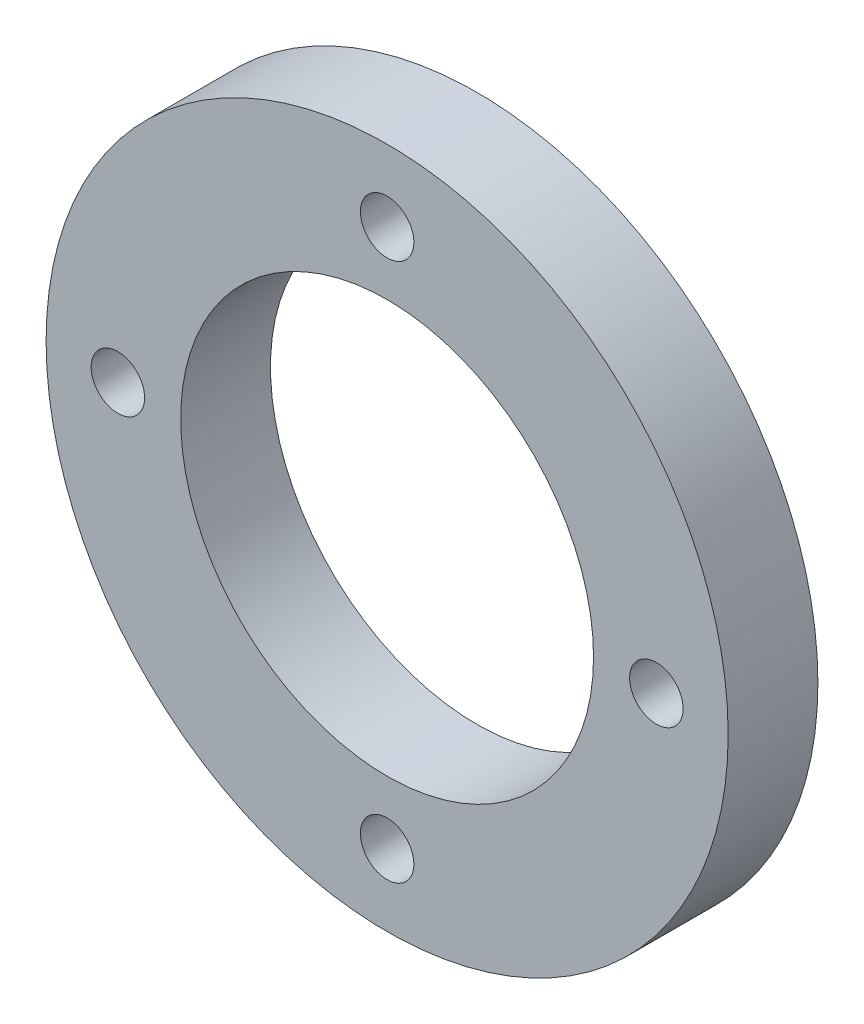
ISO-10303-21;
HEADER;
FILE_DESCRIPTION(('STEP AP214'),'2;1');
FILE_NAME('part.step','',(''),(''),'','','');
FILE_SCHEMA(('AUTOMOTIVE_DESIGN { 1 0 10303 214 1 1 1 1 }'));
ENDSEC;
DATA;
#1=APPLICATION_CONTEXT('core data for automotive mechanical design processes');
#2=APPLICATION_PROTOCOL_DEFINITION('international standard','automotive_design',2000,#1);
#3=PRODUCT_CONTEXT('',#1,'mechanical');
#4=PRODUCT('Part','Part','',(#3));
#5=PRODUCT_RELATED_PRODUCT_CATEGORY('part','',(#4));
#6=PRODUCT_DEFINITION_FORMATION('','',#4);
#7=PRODUCT_DEFINITION_CONTEXT('part definition',#1,'design');
#8=PRODUCT_DEFINITION('design','',#6,#7);
#9=PRODUCT_DEFINITION_SHAPE('','',#8);
#10=(LENGTH_UNIT() NAMED_UNIT(*) SI_UNIT(.MILLI.,.METRE.));
#11=(NAMED_UNIT(*) PLANE_ANGLE_UNIT() SI_UNIT($,.RADIAN.));
#12=(NAMED_UNIT(*) SI_UNIT($,.STERADIAN.) SOLID_ANGLE_UNIT());
#13=UNCERTAINTY_MEASURE_WITH_UNIT(LENGTH_MEASURE(1.E-05),#10,'distance_accuracy_value','');
#14=(GEOMETRIC_REPRESENTATION_CONTEXT(3) GLOBAL_UNCERTAINTY_ASSIGNED_CONTEXT((#13)) GLOBAL_UNIT_ASSIGNED_CONTEXT((#10,
#11,#12)) REPRESENTATION_CONTEXT('',''));
#15=CARTESIAN_POINT('',(0.,0.,0.));
#16=DIRECTION('',(0.,0.,1.));
#17=DIRECTION('',(1.,0.,0.));
#18=AXIS2_PLACEMENT_3D('',#15,#16,#17);
#19=CARTESIAN_POINT('',(0.,0.,5.));
#20=DIRECTION('',(0.,0.,-1.));
#21=DIRECTION('',(-1.,0.,0.));
#22=AXIS2_PLACEMENT_3D('',#19,#20,#21);
#23=CYLINDRICAL_SURFACE('',#22,11.5);
#24=CARTESIAN_POINT('',(0.,0.,5.));
#25=DIRECTION('',(0.,0.,1.));
#26=DIRECTION('',(1.,0.,0.));
#27=AXIS2_PLACEMENT_3D('',#24,#25,#26);
#28=CIRCLE('',#27,11.5);
#29=CARTESIAN_POINT('',(11.5,0.,5.));
#30=VERTEX_POINT('',#29);
#31=EDGE_CURVE('E54',#30,#30,#28,.T.);
#32=ORIENTED_EDGE('',*,*,#31,.T.);
#33=EDGE_LOOP('',(#32));
#34=FACE_BOUND('',#33,.T.);
#35=CARTESIAN_POINT('',(0.,0.,0.));
#36=DIRECTION('',(0.,0.,1.));
#37=DIRECTION('',(1.,0.,0.));
#38=AXIS2_PLACEMENT_3D('',#35,#36,#37);
#39=CIRCLE('',#38,11.5);
#40=CARTESIAN_POINT('',(11.5,0.,0.));
#41=VERTEX_POINT('',#40);
#42=EDGE_CURVE('E79',#41,#41,#39,.T.);
#43=ORIENTED_EDGE('',*,*,#42,.F.);
#44=EDGE_LOOP('',(#43));
#45=FACE_BOUND('',#44,.T.);
#46=ADVANCED_FACE('F45',(#34,#45),#23,.F.);
#47=CARTESIAN_POINT('',(0.,15.,5.));
#48=DIRECTION('',(0.,0.,-1.));
#49=DIRECTION('',(-1.,0.,0.));
#50=AXIS2_PLACEMENT_3D('',#47,#48,#49);
#51=CYLINDRICAL_SURFACE('',#50,1.49);
#52=CARTESIAN_POINT('',(0.,15.,5.));
#53=DIRECTION('',(0.,0.,1.));
#54=DIRECTION('',(1.,0.,0.));
#55=AXIS2_PLACEMENT_3D('',#52,#53,#54);
#56=CIRCLE('',#55,1.49);
#57=CARTESIAN_POINT('',(1.49,15.,5.));
#58=VERTEX_POINT('',#57);
#59=EDGE_CURVE('E60',#58,#58,#56,.T.);
#60=ORIENTED_EDGE('',*,*,#59,.T.);
#61=EDGE_LOOP('',(#60));
#62=FACE_BOUND('',#61,.T.);
#63=CARTESIAN_POINT('',(0.,15.,0.));
#64=DIRECTION('',(0.,0.,1.));
#65=DIRECTION('',(1.,0.,0.));
#66=AXIS2_PLACEMENT_3D('',#63,#64,#65);
#67=CIRCLE('',#66,1.49);
#68=CARTESIAN_POINT('',(1.49,15.,0.));
#69=VERTEX_POINT('',#68);
#70=EDGE_CURVE('E76',#69,#69,#67,.T.);
#71=ORIENTED_EDGE('',*,*,#70,.F.);
#72=EDGE_LOOP('',(#71));
#73=FACE_BOUND('',#72,.T.);
#74=ADVANCED_FACE('F106',(#62,#73),#51,.F.);
#75=CARTESIAN_POINT('',(15.,0.,5.));
#76=DIRECTION('',(0.,0.,-1.));
#77=DIRECTION('',(-1.,0.,0.));
#78=AXIS2_PLACEMENT_3D('',#75,#76,#77);
#79=CYLINDRICAL_SURFACE('',#78,1.49);
#80=CARTESIAN_POINT('',(15.,0.,5.));
#81=DIRECTION('',(0.,0.,1.));
#82=DIRECTION('',(1.,0.,0.));
#83=AXIS2_PLACEMENT_3D('',#80,#81,#82);
#84=CIRCLE('',#83,1.49);
#85=CARTESIAN_POINT('',(16.49,0.,5.));
#86=VERTEX_POINT('',#85);
#87=EDGE_CURVE('E97',#86,#86,#84,.T.);
#88=ORIENTED_EDGE('',*,*,#87,.T.);
#89=EDGE_LOOP('',(#88));
#90=FACE_BOUND('',#89,.T.);
#91=CARTESIAN_POINT('',(15.,0.,0.));
#92=DIRECTION('',(0.,0.,1.));
#93=DIRECTION('',(1.,0.,0.));
#94=AXIS2_PLACEMENT_3D('',#91,#92,#93);
#95=CIRCLE('',#94,1.49);
#96=CARTESIAN_POINT('',(16.49,0.,0.));
#97=VERTEX_POINT('',#96);
#98=EDGE_CURVE('E72',#97,#97,#95,.T.);
#99=ORIENTED_EDGE('',*,*,#98,.F.);
#100=EDGE_LOOP('',(#99));
#101=FACE_BOUND('',#100,.T.);
#102=ADVANCED_FACE('F124',(#90,#101),#79,.F.);
#103=CARTESIAN_POINT('',(0.,-15.,5.));
#104=DIRECTION('',(0.,0.,-1.));
#105=DIRECTION('',(-1.,0.,0.));
#106=AXIS2_PLACEMENT_3D('',#103,#104,#105);
#107=CYLINDRICAL_SURFACE('',#106,1.49);
#108=CARTESIAN_POINT('',(0.,-15.,5.));
#109=DIRECTION('',(0.,0.,1.));
#110=DIRECTION('',(1.,0.,0.));
#111=AXIS2_PLACEMENT_3D('',#108,#109,#110);
#112=CIRCLE('',#111,1.49);
#113=CARTESIAN_POINT('',(1.49,-15.,5.));
#114=VERTEX_POINT('',#113);
#115=EDGE_CURVE('E91',#114,#114,#112,.T.);
#116=ORIENTED_EDGE('',*,*,#115,.T.);
#117=EDGE_LOOP('',(#116));
#118=FACE_BOUND('',#117,.T.);
#119=CARTESIAN_POINT('',(0.,-15.,0.));
#120=DIRECTION('',(0.,0.,1.));
#121=DIRECTION('',(1.,0.,0.));
#122=AXIS2_PLACEMENT_3D('',#119,#120,#121);
#123=CIRCLE('',#122,1.49);
#124=CARTESIAN_POINT('',(1.49,-15.,0.));
#125=VERTEX_POINT('',#124);
#126=EDGE_CURVE('E68',#125,#125,#123,.T.);
#127=ORIENTED_EDGE('',*,*,#126,.F.);
#128=EDGE_LOOP('',(#127));
#129=FACE_BOUND('',#128,.T.);
#130=ADVANCED_FACE('F130',(#118,#129),#107,.F.);
#131=CARTESIAN_POINT('',(-15.,0.,5.));
#132=DIRECTION('',(0.,0.,-1.));
#133=DIRECTION('',(-1.,0.,0.));
#134=AXIS2_PLACEMENT_3D('',#131,#132,#133);
#135=CYLINDRICAL_SURFACE('',#134,1.49);
#136=CARTESIAN_POINT('',(-15.,0.,5.));
#137=DIRECTION('',(0.,0.,1.));
#138=DIRECTION('',(1.,0.,0.));
#139=AXIS2_PLACEMENT_3D('',#136,#137,#138);
#140=CIRCLE('',#139,1.49);
#141=CARTESIAN_POINT('',(-13.51,0.,5.));
#142=VERTEX_POINT('',#141);
#143=EDGE_CURVE('E86',#142,#142,#140,.T.);
#144=ORIENTED_EDGE('',*,*,#143,.T.);
#145=EDGE_LOOP('',(#144));
#146=FACE_BOUND('',#145,.T.);
#147=CARTESIAN_POINT('',(-15.,0.,0.));
#148=DIRECTION('',(0.,0.,1.));
#149=DIRECTION('',(1.,0.,0.));
#150=AXIS2_PLACEMENT_3D('',#147,#148,#149);
#151=CIRCLE('',#150,1.49);
#152=CARTESIAN_POINT('',(-13.51,0.,0.));
#153=VERTEX_POINT('',#152);
#154=EDGE_CURVE('E64',#153,#153,#151,.T.);
#155=ORIENTED_EDGE('',*,*,#154,.F.);
#156=EDGE_LOOP('',(#155));
#157=FACE_BOUND('',#156,.T.);
#158=ADVANCED_FACE('F47',(#146,#157),#135,.F.);
#159=CARTESIAN_POINT('',(0.,0.,5.));
#160=DIRECTION('',(0.,0.,-1.));
#161=DIRECTION('',(-1.,0.,0.));
#162=AXIS2_PLACEMENT_3D('',#159,#160,#161);
#163=CYLINDRICAL_SURFACE('',#162,19.);
#164=CARTESIAN_POINT('',(0.,0.,5.));
#165=DIRECTION('',(0.,0.,1.));
#166=DIRECTION('',(1.,0.,0.));
#167=AXIS2_PLACEMENT_3D('',#164,#165,#166);
#168=CIRCLE('',#167,19.);
#169=CARTESIAN_POINT('',(19.,0.,5.));
#170=VERTEX_POINT('',#169);
#171=EDGE_CURVE('E10',#170,#170,#168,.T.);
#172=ORIENTED_EDGE('',*,*,#171,.F.);
#173=EDGE_LOOP('',(#172));
#174=FACE_BOUND('',#173,.T.);
#175=CARTESIAN_POINT('',(0.,0.,0.));
#176=DIRECTION('',(0.,0.,1.));
#177=DIRECTION('',(1.,0.,0.));
#178=AXIS2_PLACEMENT_3D('',#175,#176,#177);
#179=CIRCLE('',#178,19.);
#180=CARTESIAN_POINT('',(19.,0.,0.));
#181=VERTEX_POINT('',#180);
#182=EDGE_CURVE('E49',#181,#181,#179,.T.);
#183=ORIENTED_EDGE('',*,*,#182,.T.);
#184=EDGE_LOOP('',(#183));
#185=FACE_BOUND('',#184,.T.);
#186=ADVANCED_FACE('F113',(#174,#185),#163,.T.);
#187=CARTESIAN_POINT('',(0.,0.,5.));
#188=DIRECTION('',(0.,0.,1.));
#189=DIRECTION('',(1.,0.,0.));
#190=AXIS2_PLACEMENT_3D('',#187,#188,#189);
#191=PLANE('',#190);
#192=ORIENTED_EDGE('',*,*,#143,.F.);
#193=EDGE_LOOP('',(#192));
#194=FACE_BOUND('',#193,.T.);
#195=ORIENTED_EDGE('',*,*,#115,.F.);
#196=EDGE_LOOP('',(#195));
#197=FACE_BOUND('',#196,.T.);
#198=ORIENTED_EDGE('',*,*,#87,.F.);
#199=EDGE_LOOP('',(#198));
#200=FACE_BOUND('',#199,.T.);
#201=ORIENTED_EDGE('',*,*,#59,.F.);
#202=EDGE_LOOP('',(#201));
#203=FACE_BOUND('',#202,.T.);
#204=ORIENTED_EDGE('',*,*,#31,.F.);
#205=EDGE_LOOP('',(#204));
#206=FACE_BOUND('',#205,.T.);
#207=ORIENTED_EDGE('',*,*,#171,.T.);
#208=EDGE_LOOP('',(#207));
#209=FACE_BOUND('',#208,.T.);
#210=ADVANCED_FACE('F109',(#194,#197,#200,#203,#206,#209),#191,.T.);
#211=CARTESIAN_POINT('',(0.,0.,0.));
#212=DIRECTION('',(0.,0.,1.));
#213=DIRECTION('',(1.,0.,0.));
#214=AXIS2_PLACEMENT_3D('',#211,#212,#213);
#215=PLANE('',#214);
#216=ORIENTED_EDGE('',*,*,#154,.T.);
#217=EDGE_LOOP('',(#216));
#218=FACE_BOUND('',#217,.T.);
#219=ORIENTED_EDGE('',*,*,#126,.T.);
#220=EDGE_LOOP('',(#219));
#221=FACE_BOUND('',#220,.T.);
#222=ORIENTED_EDGE('',*,*,#98,.T.);
#223=EDGE_LOOP('',(#222));
#224=FACE_BOUND('',#223,.T.);
#225=ORIENTED_EDGE('',*,*,#70,.T.);
#226=EDGE_LOOP('',(#225));
#227=FACE_BOUND('',#226,.T.);
#228=ORIENTED_EDGE('',*,*,#42,.T.);
#229=EDGE_LOOP('',(#228));
#230=FACE_BOUND('',#229,.T.);
#231=ORIENTED_EDGE('',*,*,#182,.F.);
#232=EDGE_LOOP('',(#231));
#233=FACE_BOUND('',#232,.T.);
#234=ADVANCED_FACE('F112',(#218,#221,#224,#227,#230,#233),#215,.F.);
#235=CLOSED_SHELL('',(#46,#74,#102,#130,#158,#186,#210,#234));
#236=MANIFOLD_SOLID_BREP('B2',#235);
#237=ADVANCED_BREP_SHAPE_REPRESENTATION('',(#18,#236),#14);
#238=SHAPE_DEFINITION_REPRESENTATION(#9,#237);
ENDSEC;
END-ISO-10303-21;
